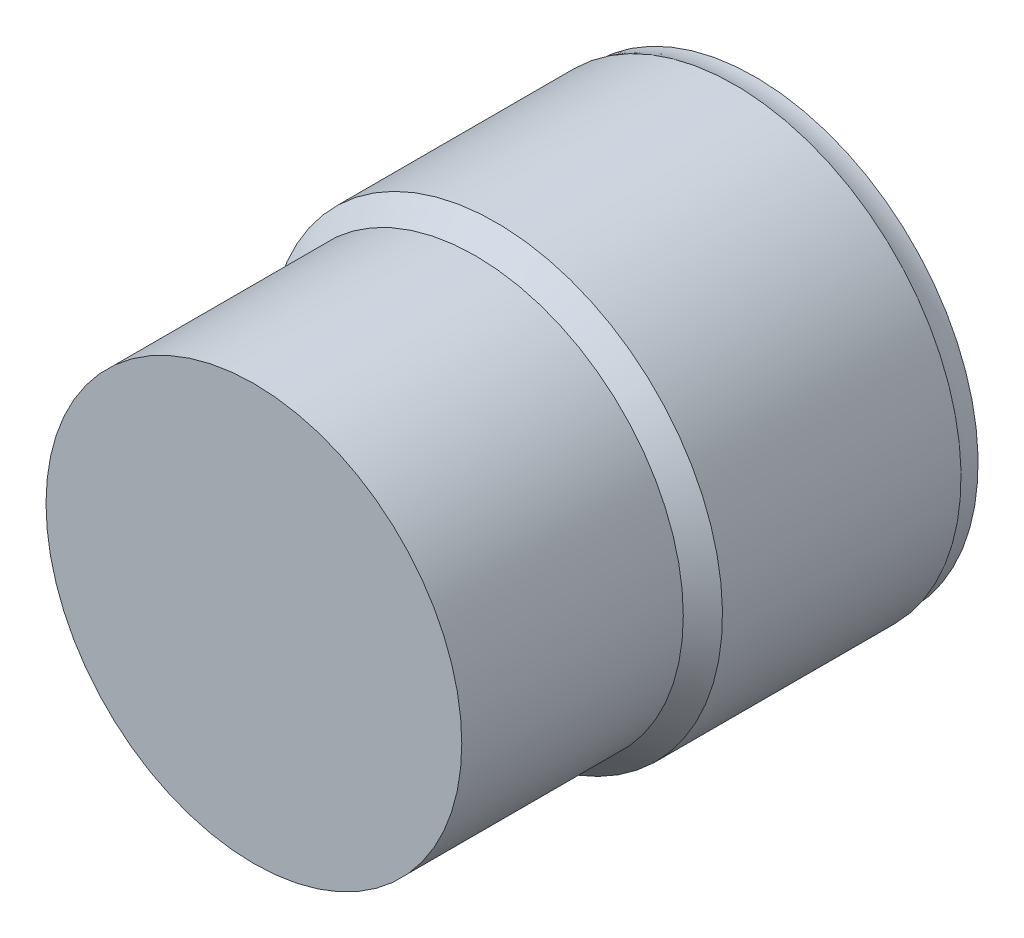
ISO-10303-21;
HEADER;
FILE_DESCRIPTION(('STEP AP214'),'2;1');
FILE_NAME('part.step','',(''),(''),'','','');
FILE_SCHEMA(('AUTOMOTIVE_DESIGN { 1 0 10303 214 1 1 1 1 }'));
ENDSEC;
DATA;
#1=APPLICATION_CONTEXT('core data for automotive mechanical design processes');
#2=APPLICATION_PROTOCOL_DEFINITION('international standard','automotive_design',2000,#1);
#3=PRODUCT_CONTEXT('',#1,'mechanical');
#4=PRODUCT('Part','Part','',(#3));
#5=PRODUCT_RELATED_PRODUCT_CATEGORY('part','',(#4));
#6=PRODUCT_DEFINITION_FORMATION('','',#4);
#7=PRODUCT_DEFINITION_CONTEXT('part definition',#1,'design');
#8=PRODUCT_DEFINITION('design','',#6,#7);
#9=PRODUCT_DEFINITION_SHAPE('','',#8);
#10=(LENGTH_UNIT() NAMED_UNIT(*) SI_UNIT(.MILLI.,.METRE.));
#11=(NAMED_UNIT(*) PLANE_ANGLE_UNIT() SI_UNIT($,.RADIAN.));
#12=(NAMED_UNIT(*) SI_UNIT($,.STERADIAN.) SOLID_ANGLE_UNIT());
#13=UNCERTAINTY_MEASURE_WITH_UNIT(LENGTH_MEASURE(1.E-05),#10,'distance_accuracy_value','');
#14=(GEOMETRIC_REPRESENTATION_CONTEXT(3) GLOBAL_UNCERTAINTY_ASSIGNED_CONTEXT((#13)) GLOBAL_UNIT_ASSIGNED_CONTEXT((#10,
#11,#12)) REPRESENTATION_CONTEXT('',''));
#15=CARTESIAN_POINT('',(0.,0.,0.));
#16=DIRECTION('',(0.,0.,1.));
#17=DIRECTION('',(1.,0.,0.));
#18=AXIS2_PLACEMENT_3D('',#15,#16,#17);
#19=CARTESIAN_POINT('',(0.,0.,-65.));
#20=DIRECTION('',(0.,0.,1.));
#21=DIRECTION('',(1.,0.,0.));
#22=AXIS2_PLACEMENT_3D('',#19,#20,#21);
#23=CYLINDRICAL_SURFACE('',#22,61.);
#24=CARTESIAN_POINT('',(0.,0.,-65.));
#25=DIRECTION('',(0.,0.,1.));
#26=DIRECTION('',(1.,0.,0.));
#27=AXIS2_PLACEMENT_3D('',#24,#25,#26);
#28=CIRCLE('',#27,61.);
#29=CARTESIAN_POINT('',(61.,0.,-65.));
#30=VERTEX_POINT('',#29);
#31=EDGE_CURVE('E57',#30,#30,#28,.F.);
#32=ORIENTED_EDGE('',*,*,#31,.F.);
#33=EDGE_LOOP('',(#32));
#34=FACE_BOUND('',#33,.T.);
#35=CARTESIAN_POINT('',(0.,0.,0.));
#36=DIRECTION('',(0.,0.,1.));
#37=DIRECTION('',(1.,0.,0.));
#38=AXIS2_PLACEMENT_3D('',#35,#36,#37);
#39=CIRCLE('',#38,61.);
#40=CARTESIAN_POINT('',(61.,0.,0.));
#41=VERTEX_POINT('',#40);
#42=EDGE_CURVE('E11',#41,#41,#39,.T.);
#43=ORIENTED_EDGE('',*,*,#42,.F.);
#44=EDGE_LOOP('',(#43));
#45=FACE_BOUND('',#44,.T.);
#46=ADVANCED_FACE('F49',(#34,#45),#23,.T.);
#47=CARTESIAN_POINT('',(0.,0.,0.));
#48=DIRECTION('',(0.,0.,1.));
#49=DIRECTION('',(1.,0.,0.));
#50=AXIS2_PLACEMENT_3D('',#47,#48,#49);
#51=PLANE('',#50);
#52=ORIENTED_EDGE('',*,*,#42,.T.);
#53=EDGE_LOOP('',(#52));
#54=FACE_BOUND('',#53,.T.);
#55=ADVANCED_FACE('F98',(#54),#51,.T.);
#56=CARTESIAN_POINT('',(0.,0.,-65.));
#57=DIRECTION('',(0.,0.,-1.));
#58=DIRECTION('',(-1.,0.,0.));
#59=AXIS2_PLACEMENT_3D('',#56,#57,#58);
#60=CONICAL_SURFACE('',#59,61.,0.741947268005917);
#61=ORIENTED_EDGE('',*,*,#31,.T.);
#62=EDGE_LOOP('',(#61));
#63=FACE_BOUND('',#62,.T.);
#64=CARTESIAN_POINT('',(0.,0.,-71.));
#65=DIRECTION('',(0.,0.,-1.));
#66=DIRECTION('',(-1.,0.,0.));
#67=AXIS2_PLACEMENT_3D('',#64,#65,#66);
#68=CIRCLE('',#67,66.5);
#69=CARTESIAN_POINT('',(-66.5,0.,-71.));
#70=VERTEX_POINT('',#69);
#71=EDGE_CURVE('E75',#70,#70,#68,.T.);
#72=ORIENTED_EDGE('',*,*,#71,.F.);
#73=EDGE_LOOP('',(#72));
#74=FACE_BOUND('',#73,.T.);
#75=ADVANCED_FACE('F89',(#63,#74),#60,.T.);
#76=CARTESIAN_POINT('',(0.,0.,-141.));
#77=DIRECTION('',(0.,0.,1.));
#78=DIRECTION('',(1.,0.,0.));
#79=AXIS2_PLACEMENT_3D('',#76,#77,#78);
#80=CYLINDRICAL_SURFACE('',#79,66.5);
#81=CARTESIAN_POINT('',(0.,0.,-141.));
#82=DIRECTION('',(0.,0.,1.));
#83=DIRECTION('',(1.,0.,0.));
#84=AXIS2_PLACEMENT_3D('',#81,#82,#83);
#85=CIRCLE('',#84,66.5);
#86=CARTESIAN_POINT('',(39.4586190825084,53.5281923858961,-141.));
#87=VERTEX_POINT('',#86);
#88=EDGE_CURVE('E63',#87,#87,#85,.F.);
#89=ORIENTED_EDGE('',*,*,#88,.F.);
#90=EDGE_LOOP('',(#89));
#91=FACE_BOUND('',#90,.T.);
#92=ORIENTED_EDGE('',*,*,#71,.T.);
#93=EDGE_LOOP('',(#92));
#94=FACE_BOUND('',#93,.T.);
#95=ADVANCED_FACE('F79',(#91,#94),#80,.T.);
#96=CARTESIAN_POINT('',(0.,0.,-147.));
#97=DIRECTION('',(0.,0.,1.));
#98=DIRECTION('',(1.,0.,0.));
#99=AXIS2_PLACEMENT_3D('',#96,#97,#98);
#100=PLANE('',#99);
#101=CARTESIAN_POINT('',(0.,0.,-147.));
#102=DIRECTION('',(0.,0.,1.));
#103=DIRECTION('',(1.,0.,0.));
#104=AXIS2_PLACEMENT_3D('',#101,#102,#103);
#105=CIRCLE('',#104,65.5);
#106=CARTESIAN_POINT('',(48.3348928794031,44.2039379505563,-147.));
#107=VERTEX_POINT('',#106);
#108=EDGE_CURVE('E111',#107,#107,#105,.T.);
#109=ORIENTED_EDGE('',*,*,#108,.F.);
#110=EDGE_LOOP('',(#109));
#111=FACE_BOUND('',#110,.T.);
#112=ADVANCED_FACE('F88',(#111),#100,.F.);
#113=CARTESIAN_POINT('',(39.4586190825084,53.5281923858961,-141.));
#114=CARTESIAN_POINT('',(48.3348928794031,44.2039379505563,-147.));
#115=CARTESIAN_POINT('',(146.515003854301,-25.3890457791206,-141.));
#116=CARTESIAN_POINT('',(136.742768780516,-52.4658478082499,-147.));
#117=CARTESIAN_POINT('',(67.5977656892839,-132.445430550913,-141.));
#118=CARTESIAN_POINT('',(40.0729830217094,-140.873723709362,-147.));
#119=CARTESIAN_POINT('',(-39.4586190825084,-53.5281923858961,-141.));
#120=CARTESIAN_POINT('',(-48.3348928794031,-44.2039379505563,-147.));
#121=CARTESIAN_POINT('',(-146.515003854301,25.3890457791206,-141.));
#122=CARTESIAN_POINT('',(-136.742768780516,52.4658478082499,-147.));
#123=CARTESIAN_POINT('',(-67.5977656892838,132.445430550913,-141.));
#124=CARTESIAN_POINT('',(-40.0729830217095,140.873723709362,-147.));
#125=CARTESIAN_POINT('',(39.4586190825084,53.5281923858961,-141.));
#126=CARTESIAN_POINT('',(48.3348928794031,44.2039379505563,-147.));
#127=(BOUNDED_SURFACE() B_SPLINE_SURFACE(3,1,((#113,#114),(#115,#116),(#117,#118),(#119,#120),
(#121,#122),(#123,#124),(#125,#126)),.UNSPECIFIED.,.T.,.F.,.F.) B_SPLINE_SURFACE_WITH_KNOTS((4,
3,4),(2,2),(0.,0.5,1.),(0.,1.),
.UNSPECIFIED.) GEOMETRIC_REPRESENTATION_ITEM() RATIONAL_B_SPLINE_SURFACE(((1.,1.),
(0.333333333333333,0.333333333333333),(0.333333333333333,0.333333333333333),(1.,1.),
(0.333333333333333,0.333333333333333),(0.333333333333333,0.333333333333333),(1.,1.))) REPRESENTATION_ITEM('') SURFACE());
#128=CARTESIAN_POINT('',(39.4586190825084,53.5281923858961,-141.));
#129=CARTESIAN_POINT('',(39.5510802678927,53.431064735528,-141.0625));
#130=CARTESIAN_POINT('',(39.643541453277,53.3339370851599,-141.125));
#131=CARTESIAN_POINT('',(39.8284638240456,53.1396817844236,-141.25));
#132=CARTESIAN_POINT('',(39.92092500943,53.0425541340555,-141.3125));
#133=CARTESIAN_POINT('',(40.1058473801986,52.8482988333193,-141.4375));
#134=CARTESIAN_POINT('',(40.1983085655829,52.7511711829511,-141.5));
#135=CARTESIAN_POINT('',(40.3832309363516,52.5569158822149,-141.625));
#136=CARTESIAN_POINT('',(40.4756921217359,52.4597882318468,-141.6875));
#137=CARTESIAN_POINT('',(40.6606144925045,52.2655329311105,-141.8125));
#138=CARTESIAN_POINT('',(40.7530756778888,52.1684052807424,-141.875));
#139=CARTESIAN_POINT('',(40.9379980486575,51.9741499800062,-142.));
#140=CARTESIAN_POINT('',(41.0304592340418,51.877022329638,-142.0625));
#141=CARTESIAN_POINT('',(41.2153816048104,51.6827670289018,-142.1875));
#142=CARTESIAN_POINT('',(41.3078427901948,51.5856393785337,-142.25));
#143=CARTESIAN_POINT('',(41.4927651609634,51.3913840777974,-142.375));
#144=CARTESIAN_POINT('',(41.5852263463477,51.2942564274293,-142.4375));
#145=CARTESIAN_POINT('',(41.7701487171164,51.100001126693,-142.5625));
#146=CARTESIAN_POINT('',(41.8626099025007,51.0028734763249,-142.625));
#147=CARTESIAN_POINT('',(42.0475322732693,50.8086181755887,-142.75));
#148=CARTESIAN_POINT('',(42.1399934586536,50.7114905252206,-142.8125));
#149=CARTESIAN_POINT('',(42.3249158294223,50.5172352244843,-142.9375));
#150=CARTESIAN_POINT('',(42.4173770148066,50.4201075741162,-143.));
#151=CARTESIAN_POINT('',(42.6022993855753,50.2258522733799,-143.125));
#152=CARTESIAN_POINT('',(42.6947605709596,50.1287246230118,-143.1875));
#153=CARTESIAN_POINT('',(42.8796829417282,49.9344693222756,-143.3125));
#154=CARTESIAN_POINT('',(42.9721441271125,49.8373416719074,-143.375));
#155=CARTESIAN_POINT('',(43.1570664978812,49.6430863711712,-143.5));
#156=CARTESIAN_POINT('',(43.2495276832655,49.5459587208031,-143.5625));
#157=CARTESIAN_POINT('',(43.4344500540341,49.3517034200668,-143.6875));
#158=CARTESIAN_POINT('',(43.5269112394184,49.2545757696987,-143.75));
#159=CARTESIAN_POINT('',(43.7118336101871,49.0603204689625,-143.875));
#160=CARTESIAN_POINT('',(43.8042947955714,48.9631928185943,-143.9375));
#161=CARTESIAN_POINT('',(43.98921716634,48.7689375178581,-144.0625));
#162=CARTESIAN_POINT('',(44.0816783517244,48.67180986749,-144.125));
#163=CARTESIAN_POINT('',(44.266600722493,48.4775545667537,-144.25));
#164=CARTESIAN_POINT('',(44.3590619078773,48.3804269163856,-144.3125));
#165=CARTESIAN_POINT('',(44.543984278646,48.1861716156493,-144.4375));
#166=CARTESIAN_POINT('',(44.6364454640303,48.0890439652812,-144.5));
#167=CARTESIAN_POINT('',(44.8213678347989,47.894788664545,-144.625));
#168=CARTESIAN_POINT('',(44.9138290201832,47.7976610141768,-144.6875));
#169=CARTESIAN_POINT('',(45.0987513909519,47.6034057134406,-144.8125));
#170=CARTESIAN_POINT('',(45.1912125763362,47.5062780630725,-144.875));
#171=CARTESIAN_POINT('',(45.3761349471049,47.3120227623362,-145.));
#172=CARTESIAN_POINT('',(45.4685961324892,47.2148951119681,-145.0625));
#173=CARTESIAN_POINT('',(45.6535185032578,47.0206398112319,-145.1875));
#174=CARTESIAN_POINT('',(45.7459796886421,46.9235121608637,-145.25));
#175=CARTESIAN_POINT('',(45.9309020594108,46.7292568601275,-145.375));
#176=CARTESIAN_POINT('',(46.0233632447951,46.6321292097594,-145.4375));
#177=CARTESIAN_POINT('',(46.2082856155637,46.4378739090231,-145.5625));
#178=CARTESIAN_POINT('',(46.3007468009481,46.340746258655,-145.625));
#179=CARTESIAN_POINT('',(46.4856691717167,46.1464909579188,-145.75));
#180=CARTESIAN_POINT('',(46.578130357101,46.0493633075506,-145.8125));
#181=CARTESIAN_POINT('',(46.7630527278697,45.8551080068144,-145.9375));
#182=CARTESIAN_POINT('',(46.855513913254,45.7579803564463,-146.));
#183=CARTESIAN_POINT('',(47.0404362840226,45.56372505571,-146.125));
#184=CARTESIAN_POINT('',(47.1328974694069,45.4665974053419,-146.1875));
#185=CARTESIAN_POINT('',(47.3178198401756,45.2723421046056,-146.3125));
#186=CARTESIAN_POINT('',(47.4102810255599,45.1752144542375,-146.375));
#187=CARTESIAN_POINT('',(47.5952033963285,44.9809591535013,-146.5));
#188=CARTESIAN_POINT('',(47.6876645817129,44.8838315031331,-146.5625));
#189=CARTESIAN_POINT('',(47.8725869524815,44.6895762023969,-146.6875));
#190=CARTESIAN_POINT('',(47.9650481378658,44.5924485520288,-146.75));
#191=CARTESIAN_POINT('',(48.1499705086345,44.3981932512925,-146.875));
#192=CARTESIAN_POINT('',(48.2424316940188,44.3010656009244,-146.9375));
#193=CARTESIAN_POINT('',(48.3348928794031,44.2039379505563,-147.));
#194=B_SPLINE_CURVE_WITH_KNOTS('',3,(#128,#129,#130,#131,#132,#133,#134,#135,#136,#137,#138,
#139,#140,#141,#142,#143,#144,#145,#146,#147,#148,#149,#150,#151,#152,#153,#154,#155,#156,#157,
#158,#159,#160,#161,#162,#163,#164,#165,#166,#167,#168,#169,#170,#171,#172,#173,#174,#175,#176,
#177,#178,#179,#180,#181,#182,#183,#184,#185,#186,#187,#188,#189,#190,#191,#192,#193),
.UNSPECIFIED.,.F.,.F.,(4,2,2,2,2,2,2,2,2,2,2,2,2,2,2,2,2,2,2,2,2,2,2,2,2,2,2,2,2,2,2,2,4),(0.,
0.443848973659236,0.887697947318469,1.3315469209777,1.77539589463693,2.21924486829617,
2.66309384195539,3.10694281561462,3.55079178927386,3.9946407629331,4.43848973659234,
4.88233871025157,5.3261876839108,5.77003665757003,6.21388563122925,6.6577346048885,
7.10158357854773,7.54543255220697,7.9892815258662,8.43313049952543,8.87697947318466,
9.3208284468439,9.76467742050312,10.2085263941624,10.6523753678216,11.0962243414808,
11.5400733151401,11.9839222887993,12.4277712624585,12.8716202361178,13.315469209777,
13.7593181834362,14.2031671570955),.UNSPECIFIED.);
#195=EDGE_CURVE('BSEAM91',#87,#107,#194,.T.);
#196=ORIENTED_EDGE('',*,*,#88,.T.);
#197=ORIENTED_EDGE('',*,*,#108,.T.);
#198=ORIENTED_EDGE('',*,*,#195,.T.);
#199=ORIENTED_EDGE('',*,*,#195,.F.);
#200=EDGE_LOOP('',(#196,#198,#197,#199));
#201=FACE_BOUND('',#200,.T.);
#202=ADVANCED_FACE('F91',(#201),#127,.T.);
#203=CLOSED_SHELL('',(#46,#55,#75,#95,#112,#202));
#204=MANIFOLD_SOLID_BREP('B2',#203);
#205=ADVANCED_BREP_SHAPE_REPRESENTATION('',(#18,#204),#14);
#206=SHAPE_DEFINITION_REPRESENTATION(#9,#205);
ENDSEC;
END-ISO-10303-21;
